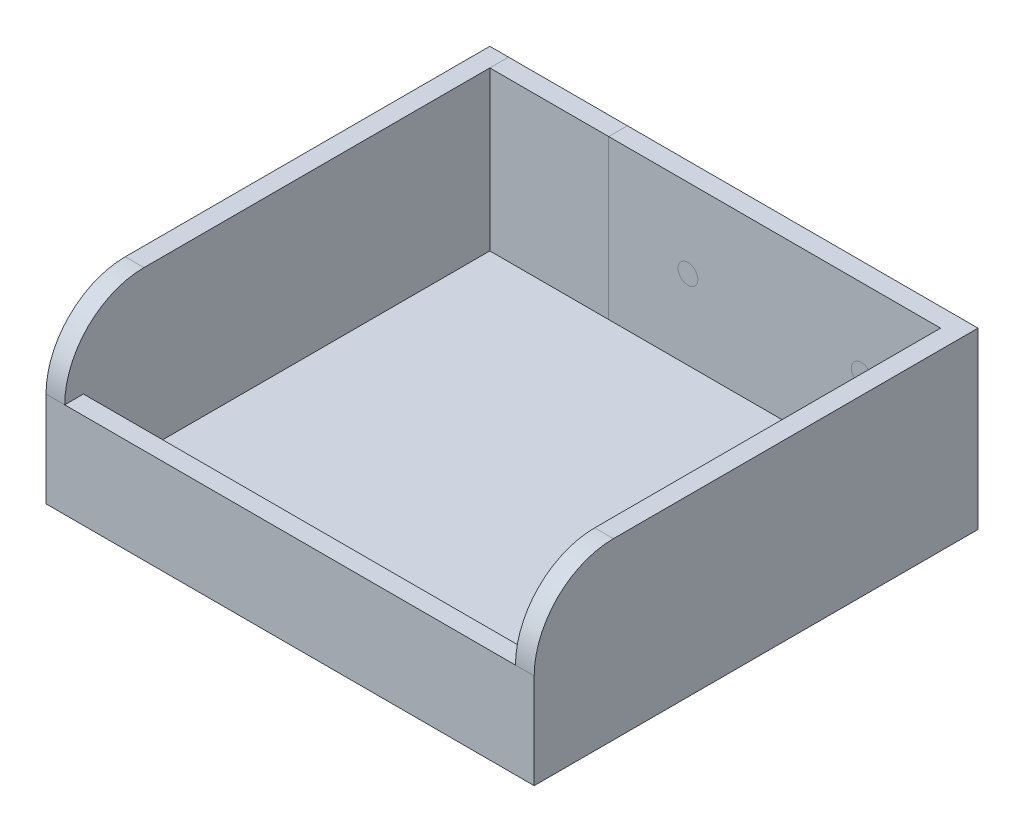
ISO-10303-21;
HEADER;
FILE_DESCRIPTION(('STEP AP214'),'2;1');
FILE_NAME('part.step','',(''),(''),'','','');
FILE_SCHEMA(('AUTOMOTIVE_DESIGN { 1 0 10303 214 1 1 1 1 }'));
ENDSEC;
DATA;
#1=APPLICATION_CONTEXT('core data for automotive mechanical design processes');
#2=APPLICATION_PROTOCOL_DEFINITION('international standard','automotive_design',2000,#1);
#3=PRODUCT_CONTEXT('',#1,'mechanical');
#4=PRODUCT('Part','Part','',(#3));
#5=PRODUCT_RELATED_PRODUCT_CATEGORY('part','',(#4));
#6=PRODUCT_DEFINITION_FORMATION('','',#4);
#7=PRODUCT_DEFINITION_CONTEXT('part definition',#1,'design');
#8=PRODUCT_DEFINITION('design','',#6,#7);
#9=PRODUCT_DEFINITION_SHAPE('','',#8);
#10=(LENGTH_UNIT() NAMED_UNIT(*) SI_UNIT(.MILLI.,.METRE.));
#11=(NAMED_UNIT(*) PLANE_ANGLE_UNIT() SI_UNIT($,.RADIAN.));
#12=(NAMED_UNIT(*) SI_UNIT($,.STERADIAN.) SOLID_ANGLE_UNIT());
#13=UNCERTAINTY_MEASURE_WITH_UNIT(LENGTH_MEASURE(1.E-05),#10,'distance_accuracy_value','');
#14=(GEOMETRIC_REPRESENTATION_CONTEXT(3) GLOBAL_UNCERTAINTY_ASSIGNED_CONTEXT((#13)) GLOBAL_UNIT_ASSIGNED_CONTEXT((#10,
#11,#12)) REPRESENTATION_CONTEXT('',''));
#15=CARTESIAN_POINT('',(0.,0.,0.));
#16=DIRECTION('',(0.,0.,1.));
#17=DIRECTION('',(1.,0.,0.));
#18=AXIS2_PLACEMENT_3D('',#15,#16,#17);
#19=CARTESIAN_POINT('',(-4.366,15.24,-35.56));
#20=DIRECTION('',(0.,0.,1.));
#21=DIRECTION('',(1.,0.,0.));
#22=AXIS2_PLACEMENT_3D('',#19,#20,#21);
#23=CYLINDRICAL_SURFACE('',#22,1.5875);
#24=CARTESIAN_POINT('',(-4.366,15.24,-35.56));
#25=DIRECTION('',(0.,0.,1.));
#26=DIRECTION('',(1.,0.,0.));
#27=AXIS2_PLACEMENT_3D('',#24,#25,#26);
#28=CIRCLE('',#27,1.5875);
#29=CARTESIAN_POINT('',(-2.77850000000001,15.24,-35.56));
#30=VERTEX_POINT('',#29);
#31=EDGE_CURVE('E11',#30,#30,#28,.T.);
#32=ORIENTED_EDGE('',*,*,#31,.T.);
#33=EDGE_LOOP('',(#32));
#34=FACE_BOUND('',#33,.T.);
#35=CARTESIAN_POINT('',(-4.366,15.24,-32.56));
#36=DIRECTION('',(0.,0.,1.));
#37=DIRECTION('',(1.,0.,0.));
#38=AXIS2_PLACEMENT_3D('',#35,#36,#37);
#39=CIRCLE('',#38,1.5875);
#40=CARTESIAN_POINT('',(-2.77850000000001,15.24,-32.56));
#41=VERTEX_POINT('',#40);
#42=EDGE_CURVE('E59',#41,#41,#39,.T.);
#43=ORIENTED_EDGE('',*,*,#42,.F.);
#44=EDGE_LOOP('',(#43));
#45=FACE_BOUND('',#44,.T.);
#46=ADVANCED_FACE('F56',(#34,#45),#23,.T.);
#47=CARTESIAN_POINT('',(-4.366,15.24,-35.56));
#48=DIRECTION('',(0.,0.,1.));
#49=DIRECTION('',(1.,0.,0.));
#50=AXIS2_PLACEMENT_3D('',#47,#48,#49);
#51=PLANE('',#50);
#52=ORIENTED_EDGE('',*,*,#31,.F.);
#53=EDGE_LOOP('',(#52));
#54=FACE_BOUND('',#53,.T.);
#55=ADVANCED_FACE('F71',(#54),#51,.F.);
#56=CARTESIAN_POINT('',(-4.366,15.24,-32.56));
#57=DIRECTION('',(0.,0.,1.));
#58=DIRECTION('',(1.,0.,0.));
#59=AXIS2_PLACEMENT_3D('',#56,#57,#58);
#60=PLANE('',#59);
#61=ORIENTED_EDGE('',*,*,#42,.T.);
#62=EDGE_LOOP('',(#61));
#63=FACE_BOUND('',#62,.T.);
#64=ADVANCED_FACE('F68',(#63),#60,.T.);
#65=CLOSED_SHELL('',(#46,#55,#64));
#66=MANIFOLD_SOLID_BREP('B2',#65);
#67=CARTESIAN_POINT('',(23.416,15.24,-35.56));
#68=DIRECTION('',(0.,0.,1.));
#69=DIRECTION('',(1.,0.,0.));
#70=AXIS2_PLACEMENT_3D('',#67,#68,#69);
#71=CYLINDRICAL_SURFACE('',#70,1.5875);
#72=CARTESIAN_POINT('',(23.416,15.24,-35.56));
#73=DIRECTION('',(0.,0.,1.));
#74=DIRECTION('',(1.,0.,0.));
#75=AXIS2_PLACEMENT_3D('',#72,#73,#74);
#76=CIRCLE('',#75,1.5875);
#77=CARTESIAN_POINT('',(25.0035,15.24,-35.56));
#78=VERTEX_POINT('',#77);
#79=EDGE_CURVE('E55',#78,#78,#76,.T.);
#80=ORIENTED_EDGE('',*,*,#79,.T.);
#81=EDGE_LOOP('',(#80));
#82=FACE_BOUND('',#81,.T.);
#83=CARTESIAN_POINT('',(23.416,15.24,-32.56));
#84=DIRECTION('',(0.,0.,1.));
#85=DIRECTION('',(1.,0.,0.));
#86=AXIS2_PLACEMENT_3D('',#83,#84,#85);
#87=CIRCLE('',#86,1.5875);
#88=CARTESIAN_POINT('',(25.0035,15.24,-32.56));
#89=VERTEX_POINT('',#88);
#90=EDGE_CURVE('E122',#89,#89,#87,.T.);
#91=ORIENTED_EDGE('',*,*,#90,.F.);
#92=EDGE_LOOP('',(#91));
#93=FACE_BOUND('',#92,.T.);
#94=ADVANCED_FACE('F119',(#82,#93),#71,.T.);
#95=CARTESIAN_POINT('',(23.416,15.24,-35.56));
#96=DIRECTION('',(0.,0.,1.));
#97=DIRECTION('',(1.,0.,0.));
#98=AXIS2_PLACEMENT_3D('',#95,#96,#97);
#99=PLANE('',#98);
#100=ORIENTED_EDGE('',*,*,#79,.F.);
#101=EDGE_LOOP('',(#100));
#102=FACE_BOUND('',#101,.T.);
#103=ADVANCED_FACE('F134',(#102),#99,.F.);
#104=CARTESIAN_POINT('',(23.416,15.24,-32.56));
#105=DIRECTION('',(0.,0.,1.));
#106=DIRECTION('',(1.,0.,0.));
#107=AXIS2_PLACEMENT_3D('',#104,#105,#106);
#108=PLANE('',#107);
#109=ORIENTED_EDGE('',*,*,#90,.T.);
#110=EDGE_LOOP('',(#109));
#111=FACE_BOUND('',#110,.T.);
#112=ADVANCED_FACE('F131',(#111),#108,.T.);
#113=CLOSED_SHELL('',(#94,#103,#112));
#114=MANIFOLD_SOLID_BREP('B6',#113);
#115=CARTESIAN_POINT('',(0.,27.94,-32.56));
#116=DIRECTION('',(0.,0.,-1.));
#117=DIRECTION('',(-1.,0.,0.));
#118=AXIS2_PLACEMENT_3D('',#115,#116,#117);
#119=PLANE('',#118);
#120=DIRECTION('',(1.,0.,0.));
#121=VECTOR('',#120,1.);
#122=CARTESIAN_POINT('',(0.,0.,-32.56));
#123=LINE('',#122,#121);
#124=CARTESIAN_POINT('',(-36.116,0.,-32.56));
#125=VERTEX_POINT('',#124);
#126=CARTESIAN_POINT('',(-17.066,0.,-32.56));
#127=VERTEX_POINT('',#126);
#128=EDGE_CURVE('E244',#125,#127,#123,.T.);
#129=ORIENTED_EDGE('',*,*,#128,.T.);
#130=DIRECTION('',(0.,-1.,0.));
#131=VECTOR('',#130,1.);
#132=CARTESIAN_POINT('',(-17.066,27.94,-32.56));
#133=LINE('',#132,#131);
#134=CARTESIAN_POINT('',(-17.066,27.94,-32.56));
#135=VERTEX_POINT('',#134);
#136=EDGE_CURVE('E117',#135,#127,#133,.T.);
#137=ORIENTED_EDGE('',*,*,#136,.F.);
#138=DIRECTION('',(1.,0.,0.));
#139=VECTOR('',#138,1.);
#140=CARTESIAN_POINT('',(0.,27.94,-32.56));
#141=LINE('',#140,#139);
#142=CARTESIAN_POINT('',(-36.116,27.94,-32.56));
#143=VERTEX_POINT('',#142);
#144=EDGE_CURVE('E230',#143,#135,#141,.T.);
#145=ORIENTED_EDGE('',*,*,#144,.F.);
#146=DIRECTION('',(0.,-1.,0.));
#147=VECTOR('',#146,1.);
#148=CARTESIAN_POINT('',(-36.116,27.94,-32.56));
#149=LINE('',#148,#147);
#150=EDGE_CURVE('E197',#143,#125,#149,.T.);
#151=ORIENTED_EDGE('',*,*,#150,.T.);
#152=EDGE_LOOP('',(#129,#137,#145,#151));
#153=FACE_BOUND('',#152,.T.);
#154=ADVANCED_FACE('F181',(#153),#119,.F.);
#155=CARTESIAN_POINT('',(-17.066,27.94,0.));
#156=DIRECTION('',(-1.,0.,0.));
#157=DIRECTION('',(0.,0.,1.));
#158=AXIS2_PLACEMENT_3D('',#155,#156,#157);
#159=PLANE('',#158);
#160=DIRECTION('',(0.,0.,-1.));
#161=VECTOR('',#160,1.);
#162=CARTESIAN_POINT('',(-17.066,0.,0.));
#163=LINE('',#162,#161);
#164=CARTESIAN_POINT('',(-17.066,0.,-35.56));
#165=VERTEX_POINT('',#164);
#166=EDGE_CURVE('E235',#127,#165,#163,.T.);
#167=ORIENTED_EDGE('',*,*,#166,.T.);
#168=DIRECTION('',(0.,-1.,0.));
#169=VECTOR('',#168,1.);
#170=CARTESIAN_POINT('',(-17.066,27.94,-35.56));
#171=LINE('',#170,#169);
#172=CARTESIAN_POINT('',(-17.066,27.94,-35.56));
#173=VERTEX_POINT('',#172);
#174=EDGE_CURVE('E189',#173,#165,#171,.T.);
#175=ORIENTED_EDGE('',*,*,#174,.F.);
#176=DIRECTION('',(0.,0.,-1.));
#177=VECTOR('',#176,1.);
#178=CARTESIAN_POINT('',(-17.066,27.94,0.));
#179=LINE('',#178,#177);
#180=EDGE_CURVE('E222',#135,#173,#179,.T.);
#181=ORIENTED_EDGE('',*,*,#180,.F.);
#182=ORIENTED_EDGE('',*,*,#136,.T.);
#183=EDGE_LOOP('',(#167,#175,#181,#182));
#184=FACE_BOUND('',#183,.T.);
#185=ADVANCED_FACE('F234',(#184),#159,.F.);
#186=CARTESIAN_POINT('',(0.,27.94,-35.56));
#187=DIRECTION('',(0.,0.,-1.));
#188=DIRECTION('',(-1.,0.,0.));
#189=AXIS2_PLACEMENT_3D('',#186,#187,#188);
#190=PLANE('',#189);
#191=DIRECTION('',(1.,0.,0.));
#192=VECTOR('',#191,1.);
#193=CARTESIAN_POINT('',(0.,0.,-35.56));
#194=LINE('',#193,#192);
#195=CARTESIAN_POINT('',(-36.116,0.,-35.56));
#196=VERTEX_POINT('',#195);
#197=EDGE_CURVE('E247',#196,#165,#194,.T.);
#198=ORIENTED_EDGE('',*,*,#197,.F.);
#199=DIRECTION('',(0.,-1.,0.));
#200=VECTOR('',#199,1.);
#201=CARTESIAN_POINT('',(-36.116,27.94,-35.56));
#202=LINE('',#201,#200);
#203=CARTESIAN_POINT('',(-36.116,27.94,-35.56));
#204=VERTEX_POINT('',#203);
#205=EDGE_CURVE('E211',#204,#196,#202,.T.);
#206=ORIENTED_EDGE('',*,*,#205,.F.);
#207=DIRECTION('',(1.,0.,0.));
#208=VECTOR('',#207,1.);
#209=CARTESIAN_POINT('',(0.,27.94,-35.56));
#210=LINE('',#209,#208);
#211=EDGE_CURVE('E229',#204,#173,#210,.T.);
#212=ORIENTED_EDGE('',*,*,#211,.T.);
#213=ORIENTED_EDGE('',*,*,#174,.T.);
#214=EDGE_LOOP('',(#198,#206,#212,#213));
#215=FACE_BOUND('',#214,.T.);
#216=ADVANCED_FACE('F238',(#215),#190,.T.);
#217=CARTESIAN_POINT('',(-36.116,27.94,0.));
#218=DIRECTION('',(-1.,0.,0.));
#219=DIRECTION('',(0.,0.,1.));
#220=AXIS2_PLACEMENT_3D('',#217,#218,#219);
#221=PLANE('',#220);
#222=DIRECTION('',(0.,0.,-1.));
#223=VECTOR('',#222,1.);
#224=CARTESIAN_POINT('',(-36.116,0.,0.));
#225=LINE('',#224,#223);
#226=EDGE_CURVE('E249',#125,#196,#225,.T.);
#227=ORIENTED_EDGE('',*,*,#226,.F.);
#228=ORIENTED_EDGE('',*,*,#150,.F.);
#229=DIRECTION('',(0.,0.,-1.));
#230=VECTOR('',#229,1.);
#231=CARTESIAN_POINT('',(-36.116,27.94,0.));
#232=LINE('',#231,#230);
#233=EDGE_CURVE('E239',#143,#204,#232,.T.);
#234=ORIENTED_EDGE('',*,*,#233,.T.);
#235=ORIENTED_EDGE('',*,*,#205,.T.);
#236=EDGE_LOOP('',(#227,#228,#234,#235));
#237=FACE_BOUND('',#236,.T.);
#238=ADVANCED_FACE('F255',(#237),#221,.T.);
#239=CARTESIAN_POINT('',(0.,27.94,0.));
#240=DIRECTION('',(0.,1.,0.));
#241=DIRECTION('',(0.,0.,1.));
#242=AXIS2_PLACEMENT_3D('',#239,#240,#241);
#243=PLANE('',#242);
#244=ORIENTED_EDGE('',*,*,#144,.T.);
#245=ORIENTED_EDGE('',*,*,#180,.T.);
#246=ORIENTED_EDGE('',*,*,#211,.F.);
#247=ORIENTED_EDGE('',*,*,#233,.F.);
#248=EDGE_LOOP('',(#244,#245,#246,#247));
#249=FACE_BOUND('',#248,.T.);
#250=ADVANCED_FACE('F226',(#249),#243,.T.);
#251=CARTESIAN_POINT('',(0.,0.,0.));
#252=DIRECTION('',(0.,1.,0.));
#253=DIRECTION('',(0.,0.,1.));
#254=AXIS2_PLACEMENT_3D('',#251,#252,#253);
#255=PLANE('',#254);
#256=ORIENTED_EDGE('',*,*,#128,.F.);
#257=ORIENTED_EDGE('',*,*,#226,.T.);
#258=ORIENTED_EDGE('',*,*,#197,.T.);
#259=ORIENTED_EDGE('',*,*,#166,.F.);
#260=EDGE_LOOP('',(#256,#257,#258,#259));
#261=FACE_BOUND('',#260,.T.);
#262=ADVANCED_FACE('F254',(#261),#255,.F.);
#263=CLOSED_SHELL('',(#154,#185,#216,#238,#250,#262));
#264=MANIFOLD_SOLID_BREP('B50',#263);
#265=CARTESIAN_POINT('',(0.,27.94,0.));
#266=DIRECTION('',(0.,1.,0.));
#267=DIRECTION('',(0.,0.,1.));
#268=AXIS2_PLACEMENT_3D('',#265,#266,#267);
#269=PLANE('',#268);
#270=DIRECTION('',(0.,0.,1.));
#271=VECTOR('',#270,1.);
#272=CARTESIAN_POINT('',(-39.116,27.94,0.));
#273=LINE('',#272,#271);
#274=CARTESIAN_POINT('',(-39.116,27.94,-35.56));
#275=VERTEX_POINT('',#274);
#276=CARTESIAN_POINT('',(-39.116,27.94,22.86));
#277=VERTEX_POINT('',#276);
#278=EDGE_CURVE('E533',#275,#277,#273,.T.);
#279=ORIENTED_EDGE('',*,*,#278,.T.);
#280=DIRECTION('',(1.,0.,0.));
#281=VECTOR('',#280,1.);
#282=CARTESIAN_POINT('',(-36.116,27.94,22.86));
#283=LINE('',#282,#281);
#284=CARTESIAN_POINT('',(-36.116,27.94,22.86));
#285=VERTEX_POINT('',#284);
#286=EDGE_CURVE('E467',#277,#285,#283,.T.);
#287=ORIENTED_EDGE('',*,*,#286,.T.);
#288=DIRECTION('',(0.,0.,1.));
#289=VECTOR('',#288,1.);
#290=CARTESIAN_POINT('',(-36.116,27.94,0.));
#291=LINE('',#290,#289);
#292=CARTESIAN_POINT('',(-36.116,27.94,-35.56));
#293=VERTEX_POINT('',#292);
#294=EDGE_CURVE('E539',#293,#285,#291,.T.);
#295=ORIENTED_EDGE('',*,*,#294,.F.);
#296=DIRECTION('',(1.,0.,0.));
#297=VECTOR('',#296,1.);
#298=CARTESIAN_POINT('',(0.,27.94,-35.56));
#299=LINE('',#298,#297);
#300=EDGE_CURVE('E536',#275,#293,#299,.T.);
#301=ORIENTED_EDGE('',*,*,#300,.F.);
#302=EDGE_LOOP('',(#279,#287,#295,#301));
#303=FACE_BOUND('',#302,.T.);
#304=ADVANCED_FACE('F329',(#303),#269,.T.);
#305=CARTESIAN_POINT('',(-36.116,2.54,-32.56));
#306=DIRECTION('',(0.,0.,-1.));
#307=DIRECTION('',(-1.,0.,0.));
#308=AXIS2_PLACEMENT_3D('',#305,#306,#307);
#309=PLANE('',#308);
#310=DIRECTION('',(0.,-1.,0.));
#311=VECTOR('',#310,1.);
#312=CARTESIAN_POINT('',(-17.066,27.94,-32.56));
#313=LINE('',#312,#311);
#314=CARTESIAN_POINT('',(-17.066,2.54,-32.56));
#315=VERTEX_POINT('',#314);
#316=CARTESIAN_POINT('',(-17.066,0.,-32.56));
#317=VERTEX_POINT('',#316);
#318=EDGE_CURVE('E493',#315,#317,#313,.T.);
#319=ORIENTED_EDGE('',*,*,#318,.T.);
#320=DIRECTION('',(1.,0.,0.));
#321=VECTOR('',#320,1.);
#322=CARTESIAN_POINT('',(-36.116,0.,-32.56));
#323=LINE('',#322,#321);
#324=CARTESIAN_POINT('',(-36.116,0.,-32.56));
#325=VERTEX_POINT('',#324);
#326=EDGE_CURVE('E474',#325,#317,#323,.T.);
#327=ORIENTED_EDGE('',*,*,#326,.F.);
#328=DIRECTION('',(0.,-1.,0.));
#329=VECTOR('',#328,1.);
#330=CARTESIAN_POINT('',(-36.116,2.54,-32.56));
#331=LINE('',#330,#329);
#332=CARTESIAN_POINT('',(-36.116,2.54,-32.56));
#333=VERTEX_POINT('',#332);
#334=EDGE_CURVE('E470',#333,#325,#331,.T.);
#335=ORIENTED_EDGE('',*,*,#334,.F.);
#336=DIRECTION('',(1.,0.,0.));
#337=VECTOR('',#336,1.);
#338=CARTESIAN_POINT('',(-36.116,2.54,-32.56));
#339=LINE('',#338,#337);
#340=EDGE_CURVE('E477',#333,#315,#339,.T.);
#341=ORIENTED_EDGE('',*,*,#340,.T.);
#342=EDGE_LOOP('',(#319,#327,#335,#341));
#343=FACE_BOUND('',#342,.T.);
#344=ADVANCED_FACE('F589',(#343),#309,.T.);
#345=CARTESIAN_POINT('',(0.,2.54,0.));
#346=DIRECTION('',(0.,-1.,0.));
#347=DIRECTION('',(0.,0.,-1.));
#348=AXIS2_PLACEMENT_3D('',#345,#346,#347);
#349=PLANE('',#348);
#350=ORIENTED_EDGE('',*,*,#340,.F.);
#351=DIRECTION('',(0.,0.,1.));
#352=VECTOR('',#351,1.);
#353=CARTESIAN_POINT('',(-36.116,2.54,-32.56));
#354=LINE('',#353,#352);
#355=CARTESIAN_POINT('',(-36.116,2.54,32.56));
#356=VERTEX_POINT('',#355);
#357=EDGE_CURVE('E473',#333,#356,#354,.T.);
#358=ORIENTED_EDGE('',*,*,#357,.T.);
#359=DIRECTION('',(1.,0.,0.));
#360=VECTOR('',#359,1.);
#361=CARTESIAN_POINT('',(-36.116,2.54,32.56));
#362=LINE('',#361,#360);
#363=CARTESIAN_POINT('',(36.116,2.54,32.56));
#364=VERTEX_POINT('',#363);
#365=EDGE_CURVE('E481',#356,#364,#362,.T.);
#366=ORIENTED_EDGE('',*,*,#365,.T.);
#367=DIRECTION('',(0.,0.,1.));
#368=VECTOR('',#367,1.);
#369=CARTESIAN_POINT('',(36.116,2.54,-32.56));
#370=LINE('',#369,#368);
#371=CARTESIAN_POINT('',(36.116,2.54,-32.56));
#372=VERTEX_POINT('',#371);
#373=EDGE_CURVE('E484',#372,#364,#370,.T.);
#374=ORIENTED_EDGE('',*,*,#373,.F.);
#375=DIRECTION('',(1.,0.,0.));
#376=VECTOR('',#375,1.);
#377=CARTESIAN_POINT('',(0.,2.54,-32.56));
#378=LINE('',#377,#376);
#379=EDGE_CURVE('E478',#315,#372,#378,.T.);
#380=ORIENTED_EDGE('',*,*,#379,.F.);
#381=EDGE_LOOP('',(#350,#358,#366,#374,#380));
#382=FACE_BOUND('',#381,.T.);
#383=ADVANCED_FACE('F602',(#382),#349,.F.);
#384=CARTESIAN_POINT('',(0.,0.,0.));
#385=DIRECTION('',(0.,-1.,0.));
#386=DIRECTION('',(0.,0.,-1.));
#387=AXIS2_PLACEMENT_3D('',#384,#385,#386);
#388=PLANE('',#387);
#389=ORIENTED_EDGE('',*,*,#326,.T.);
#390=DIRECTION('',(0.,0.,-1.));
#391=VECTOR('',#390,1.);
#392=CARTESIAN_POINT('',(-17.066,0.,0.));
#393=LINE('',#392,#391);
#394=CARTESIAN_POINT('',(-17.066,0.,-35.56));
#395=VERTEX_POINT('',#394);
#396=EDGE_CURVE('E527',#317,#395,#393,.T.);
#397=ORIENTED_EDGE('',*,*,#396,.T.);
#398=DIRECTION('',(1.,0.,0.));
#399=VECTOR('',#398,1.);
#400=CARTESIAN_POINT('',(0.,0.,-35.56));
#401=LINE('',#400,#399);
#402=CARTESIAN_POINT('',(39.116,0.,-35.56));
#403=VERTEX_POINT('',#402);
#404=EDGE_CURVE('E515',#395,#403,#401,.T.);
#405=ORIENTED_EDGE('',*,*,#404,.T.);
#406=DIRECTION('',(0.,0.,1.));
#407=VECTOR('',#406,1.);
#408=CARTESIAN_POINT('',(39.116,0.,0.));
#409=LINE('',#408,#407);
#410=CARTESIAN_POINT('',(39.116,0.,35.56));
#411=VERTEX_POINT('',#410);
#412=EDGE_CURVE('E512',#403,#411,#409,.T.);
#413=ORIENTED_EDGE('',*,*,#412,.T.);
#414=DIRECTION('',(1.,0.,0.));
#415=VECTOR('',#414,1.);
#416=CARTESIAN_POINT('',(0.,0.,35.56));
#417=LINE('',#416,#415);
#418=CARTESIAN_POINT('',(-39.116,0.,35.56));
#419=VERTEX_POINT('',#418);
#420=EDGE_CURVE('E516',#419,#411,#417,.T.);
#421=ORIENTED_EDGE('',*,*,#420,.F.);
#422=DIRECTION('',(0.,0.,1.));
#423=VECTOR('',#422,1.);
#424=CARTESIAN_POINT('',(-39.116,0.,0.));
#425=LINE('',#424,#423);
#426=CARTESIAN_POINT('',(-39.116,0.,-35.56));
#427=VERTEX_POINT('',#426);
#428=EDGE_CURVE('E518',#427,#419,#425,.T.);
#429=ORIENTED_EDGE('',*,*,#428,.F.);
#430=CARTESIAN_POINT('',(-36.116,0.,-35.56));
#431=VERTEX_POINT('',#430);
#432=EDGE_CURVE('E521',#427,#431,#401,.T.);
#433=ORIENTED_EDGE('',*,*,#432,.T.);
#434=DIRECTION('',(0.,0.,1.));
#435=VECTOR('',#434,1.);
#436=CARTESIAN_POINT('',(-36.116,0.,0.));
#437=LINE('',#436,#435);
#438=EDGE_CURVE('E524',#431,#325,#437,.T.);
#439=ORIENTED_EDGE('',*,*,#438,.T.);
#440=EDGE_LOOP('',(#389,#397,#405,#413,#421,#429,#433,#439));
#441=FACE_BOUND('',#440,.T.);
#442=ADVANCED_FACE('F576',(#441),#388,.T.);
#443=CARTESIAN_POINT('',(0.,27.94,-32.56));
#444=DIRECTION('',(0.,0.,-1.));
#445=DIRECTION('',(-1.,0.,0.));
#446=AXIS2_PLACEMENT_3D('',#443,#444,#445);
#447=PLANE('',#446);
#448=CARTESIAN_POINT('',(23.416,15.24,-32.56));
#449=DIRECTION('',(0.,0.,1.));
#450=DIRECTION('',(1.,0.,0.));
#451=AXIS2_PLACEMENT_3D('',#448,#449,#450);
#452=CIRCLE('',#451,1.5875);
#453=CARTESIAN_POINT('',(25.0035,15.24,-32.56));
#454=VERTEX_POINT('',#453);
#455=EDGE_CURVE('E557',#454,#454,#452,.T.);
#456=ORIENTED_EDGE('',*,*,#455,.F.);
#457=EDGE_LOOP('',(#456));
#458=FACE_BOUND('',#457,.T.);
#459=CARTESIAN_POINT('',(-4.366,15.24,-32.56));
#460=DIRECTION('',(0.,0.,1.));
#461=DIRECTION('',(1.,0.,0.));
#462=AXIS2_PLACEMENT_3D('',#459,#460,#461);
#463=CIRCLE('',#462,1.5875);
#464=CARTESIAN_POINT('',(-2.77850000000001,15.24,-32.56));
#465=VERTEX_POINT('',#464);
#466=EDGE_CURVE('E554',#465,#465,#463,.T.);
#467=ORIENTED_EDGE('',*,*,#466,.F.);
#468=EDGE_LOOP('',(#467));
#469=FACE_BOUND('',#468,.T.);
#470=CARTESIAN_POINT('',(-17.066,27.94,-32.56));
#471=VERTEX_POINT('',#470);
#472=EDGE_CURVE('E490',#471,#315,#313,.T.);
#473=ORIENTED_EDGE('',*,*,#472,.T.);
#474=ORIENTED_EDGE('',*,*,#379,.T.);
#475=DIRECTION('',(0.,-1.,0.));
#476=VECTOR('',#475,1.);
#477=CARTESIAN_POINT('',(36.116,27.94,-32.56));
#478=LINE('',#477,#476);
#479=CARTESIAN_POINT('',(36.116,27.94,-32.56));
#480=VERTEX_POINT('',#479);
#481=EDGE_CURVE('E494',#480,#372,#478,.T.);
#482=ORIENTED_EDGE('',*,*,#481,.F.);
#483=DIRECTION('',(1.,0.,0.));
#484=VECTOR('',#483,1.);
#485=CARTESIAN_POINT('',(0.,27.94,-32.56));
#486=LINE('',#485,#484);
#487=EDGE_CURVE('E544',#471,#480,#486,.T.);
#488=ORIENTED_EDGE('',*,*,#487,.F.);
#489=EDGE_LOOP('',(#473,#474,#482,#488));
#490=FACE_BOUND('',#489,.T.);
#491=ADVANCED_FACE('F573',(#458,#469,#490),#447,.F.);
#492=CARTESIAN_POINT('',(36.116,27.94,0.));
#493=DIRECTION('',(1.,0.,0.));
#494=DIRECTION('',(0.,0.,-1.));
#495=AXIS2_PLACEMENT_3D('',#492,#493,#494);
#496=PLANE('',#495);
#497=DIRECTION('',(0.,0.,1.));
#498=VECTOR('',#497,1.);
#499=CARTESIAN_POINT('',(36.116,15.24,7.61999999999999));
#500=LINE('',#499,#498);
#501=CARTESIAN_POINT('',(36.116,15.24,32.56));
#502=VERTEX_POINT('',#501);
#503=CARTESIAN_POINT('',(36.116,15.24,35.56));
#504=VERTEX_POINT('',#503);
#505=EDGE_CURVE('E444',#502,#504,#500,.T.);
#506=ORIENTED_EDGE('',*,*,#505,.T.);
#507=CARTESIAN_POINT('',(36.116,15.24,22.86));
#508=DIRECTION('',(1.,0.,0.));
#509=DIRECTION('',(0.,0.,-1.));
#510=AXIS2_PLACEMENT_3D('',#507,#508,#509);
#511=CIRCLE('',#510,12.7);
#512=CARTESIAN_POINT('',(36.116,27.94,22.86));
#513=VERTEX_POINT('',#512);
#514=EDGE_CURVE('E179',#504,#513,#511,.F.);
#515=ORIENTED_EDGE('',*,*,#514,.T.);
#516=DIRECTION('',(0.,0.,1.));
#517=VECTOR('',#516,1.);
#518=CARTESIAN_POINT('',(36.116,27.94,0.));
#519=LINE('',#518,#517);
#520=EDGE_CURVE('E542',#480,#513,#519,.T.);
#521=ORIENTED_EDGE('',*,*,#520,.F.);
#522=ORIENTED_EDGE('',*,*,#481,.T.);
#523=ORIENTED_EDGE('',*,*,#373,.T.);
#524=DIRECTION('',(0.,-1.,0.));
#525=VECTOR('',#524,1.);
#526=CARTESIAN_POINT('',(36.116,27.94,32.56));
#527=LINE('',#526,#525);
#528=EDGE_CURVE('E447',#502,#364,#527,.T.);
#529=ORIENTED_EDGE('',*,*,#528,.F.);
#530=EDGE_LOOP('',(#506,#515,#521,#522,#523,#529));
#531=FACE_BOUND('',#530,.T.);
#532=ADVANCED_FACE('F445',(#531),#496,.F.);
#533=CARTESIAN_POINT('',(0.,27.94,32.56));
#534=DIRECTION('',(0.,0.,-1.));
#535=DIRECTION('',(-1.,0.,0.));
#536=AXIS2_PLACEMENT_3D('',#533,#534,#535);
#537=PLANE('',#536);
#538=DIRECTION('',(-1.,0.,0.));
#539=VECTOR('',#538,1.);
#540=CARTESIAN_POINT('',(0.,15.24,32.56));
#541=LINE('',#540,#539);
#542=CARTESIAN_POINT('',(-36.116,15.24,32.56));
#543=VERTEX_POINT('',#542);
#544=EDGE_CURVE('E530',#502,#543,#541,.T.);
#545=ORIENTED_EDGE('',*,*,#544,.F.);
#546=ORIENTED_EDGE('',*,*,#528,.T.);
#547=ORIENTED_EDGE('',*,*,#365,.F.);
#548=DIRECTION('',(0.,-1.,0.));
#549=VECTOR('',#548,1.);
#550=CARTESIAN_POINT('',(-36.116,27.94,32.56));
#551=LINE('',#550,#549);
#552=EDGE_CURVE('E498',#543,#356,#551,.T.);
#553=ORIENTED_EDGE('',*,*,#552,.F.);
#554=EDGE_LOOP('',(#545,#546,#547,#553));
#555=FACE_BOUND('',#554,.T.);
#556=ADVANCED_FACE('F658',(#555),#537,.T.);
#557=CARTESIAN_POINT('',(-17.066,27.94,0.));
#558=DIRECTION('',(-1.,0.,0.));
#559=DIRECTION('',(0.,0.,1.));
#560=AXIS2_PLACEMENT_3D('',#557,#558,#559);
#561=PLANE('',#560);
#562=ORIENTED_EDGE('',*,*,#396,.F.);
#563=ORIENTED_EDGE('',*,*,#318,.F.);
#564=ORIENTED_EDGE('',*,*,#472,.F.);
#565=DIRECTION('',(0.,0.,-1.));
#566=VECTOR('',#565,1.);
#567=CARTESIAN_POINT('',(-17.066,27.94,0.));
#568=LINE('',#567,#566);
#569=CARTESIAN_POINT('',(-17.066,27.94,-35.56));
#570=VERTEX_POINT('',#569);
#571=EDGE_CURVE('E546',#471,#570,#568,.T.);
#572=ORIENTED_EDGE('',*,*,#571,.T.);
#573=DIRECTION('',(0.,-1.,0.));
#574=VECTOR('',#573,1.);
#575=CARTESIAN_POINT('',(-17.066,27.94,-35.56));
#576=LINE('',#575,#574);
#577=EDGE_CURVE('E509',#570,#395,#576,.T.);
#578=ORIENTED_EDGE('',*,*,#577,.T.);
#579=EDGE_LOOP('',(#562,#563,#564,#572,#578));
#580=FACE_BOUND('',#579,.T.);
#581=ADVANCED_FACE('F586',(#580),#561,.T.);
#582=CARTESIAN_POINT('',(-36.116,27.94,0.));
#583=DIRECTION('',(1.,0.,0.));
#584=DIRECTION('',(0.,0.,-1.));
#585=AXIS2_PLACEMENT_3D('',#582,#583,#584);
#586=PLANE('',#585);
#587=ORIENTED_EDGE('',*,*,#294,.T.);
#588=CARTESIAN_POINT('',(-36.116,15.24,22.86));
#589=DIRECTION('',(1.,0.,0.));
#590=DIRECTION('',(0.,0.,-1.));
#591=AXIS2_PLACEMENT_3D('',#588,#589,#590);
#592=CIRCLE('',#591,12.7);
#593=CARTESIAN_POINT('',(-36.116,15.24,35.56));
#594=VERTEX_POINT('',#593);
#595=EDGE_CURVE('E441',#285,#594,#592,.T.);
#596=ORIENTED_EDGE('',*,*,#595,.T.);
#597=DIRECTION('',(0.,0.,1.));
#598=VECTOR('',#597,1.);
#599=CARTESIAN_POINT('',(-36.116,15.24,7.61999999999999));
#600=LINE('',#599,#598);
#601=EDGE_CURVE('E450',#543,#594,#600,.T.);
#602=ORIENTED_EDGE('',*,*,#601,.F.);
#603=ORIENTED_EDGE('',*,*,#552,.T.);
#604=ORIENTED_EDGE('',*,*,#357,.F.);
#605=ORIENTED_EDGE('',*,*,#334,.T.);
#606=ORIENTED_EDGE('',*,*,#438,.F.);
#607=DIRECTION('',(0.,-1.,0.));
#608=VECTOR('',#607,1.);
#609=CARTESIAN_POINT('',(-36.116,27.94,-35.56));
#610=LINE('',#609,#608);
#611=EDGE_CURVE('E500',#293,#431,#610,.T.);
#612=ORIENTED_EDGE('',*,*,#611,.F.);
#613=EDGE_LOOP('',(#587,#596,#602,#603,#604,#605,#606,#612));
#614=FACE_BOUND('',#613,.T.);
#615=ADVANCED_FACE('F598',(#614),#586,.T.);
#616=CARTESIAN_POINT('',(0.,27.94,-35.56));
#617=DIRECTION('',(0.,0.,-1.));
#618=DIRECTION('',(-1.,0.,0.));
#619=AXIS2_PLACEMENT_3D('',#616,#617,#618);
#620=PLANE('',#619);
#621=ORIENTED_EDGE('',*,*,#432,.F.);
#622=DIRECTION('',(0.,-1.,0.));
#623=VECTOR('',#622,1.);
#624=CARTESIAN_POINT('',(-39.116,27.94,-35.56));
#625=LINE('',#624,#623);
#626=EDGE_CURVE('E502',#275,#427,#625,.T.);
#627=ORIENTED_EDGE('',*,*,#626,.F.);
#628=ORIENTED_EDGE('',*,*,#300,.T.);
#629=ORIENTED_EDGE('',*,*,#611,.T.);
#630=EDGE_LOOP('',(#621,#627,#628,#629));
#631=FACE_BOUND('',#630,.T.);
#632=ADVANCED_FACE('F617',(#631),#620,.T.);
#633=CARTESIAN_POINT('',(-39.116,27.94,0.));
#634=DIRECTION('',(1.,0.,0.));
#635=DIRECTION('',(0.,0.,-1.));
#636=AXIS2_PLACEMENT_3D('',#633,#634,#635);
#637=PLANE('',#636);
#638=DIRECTION('',(0.,-1.,0.));
#639=VECTOR('',#638,1.);
#640=CARTESIAN_POINT('',(-39.116,27.94,35.56));
#641=LINE('',#640,#639);
#642=CARTESIAN_POINT('',(-39.116,15.24,35.56));
#643=VERTEX_POINT('',#642);
#644=EDGE_CURVE('E504',#643,#419,#641,.T.);
#645=ORIENTED_EDGE('',*,*,#644,.F.);
#646=CARTESIAN_POINT('',(-39.116,15.24,22.86));
#647=DIRECTION('',(1.,0.,0.));
#648=DIRECTION('',(0.,0.,-1.));
#649=AXIS2_PLACEMENT_3D('',#646,#647,#648);
#650=CIRCLE('',#649,12.7);
#651=EDGE_CURVE('E461',#643,#277,#650,.F.);
#652=ORIENTED_EDGE('',*,*,#651,.T.);
#653=ORIENTED_EDGE('',*,*,#278,.F.);
#654=ORIENTED_EDGE('',*,*,#626,.T.);
#655=ORIENTED_EDGE('',*,*,#428,.T.);
#656=EDGE_LOOP('',(#645,#652,#653,#654,#655));
#657=FACE_BOUND('',#656,.T.);
#658=ADVANCED_FACE('F614',(#657),#637,.F.);
#659=CARTESIAN_POINT('',(0.,27.94,35.56));
#660=DIRECTION('',(0.,0.,-1.));
#661=DIRECTION('',(-1.,0.,0.));
#662=AXIS2_PLACEMENT_3D('',#659,#660,#661);
#663=PLANE('',#662);
#664=DIRECTION('',(1.,0.,0.));
#665=VECTOR('',#664,1.);
#666=CARTESIAN_POINT('',(0.,15.24,35.56));
#667=LINE('',#666,#665);
#668=EDGE_CURVE('E436',#594,#504,#667,.T.);
#669=ORIENTED_EDGE('',*,*,#668,.F.);
#670=DIRECTION('',(1.,0.,0.));
#671=VECTOR('',#670,1.);
#672=CARTESIAN_POINT('',(-39.116,15.24,35.56));
#673=LINE('',#672,#671);
#674=EDGE_CURVE('E440',#594,#643,#673,.F.);
#675=ORIENTED_EDGE('',*,*,#674,.T.);
#676=ORIENTED_EDGE('',*,*,#644,.T.);
#677=ORIENTED_EDGE('',*,*,#420,.T.);
#678=DIRECTION('',(0.,-1.,0.));
#679=VECTOR('',#678,1.);
#680=CARTESIAN_POINT('',(39.116,27.94,35.56));
#681=LINE('',#680,#679);
#682=CARTESIAN_POINT('',(39.116,15.24,35.56));
#683=VERTEX_POINT('',#682);
#684=EDGE_CURVE('E439',#683,#411,#681,.T.);
#685=ORIENTED_EDGE('',*,*,#684,.F.);
#686=DIRECTION('',(1.,0.,0.));
#687=VECTOR('',#686,1.);
#688=CARTESIAN_POINT('',(36.116,15.24,35.56));
#689=LINE('',#688,#687);
#690=EDGE_CURVE('E433',#683,#504,#689,.F.);
#691=ORIENTED_EDGE('',*,*,#690,.T.);
#692=EDGE_LOOP('',(#669,#675,#676,#677,#685,#691));
#693=FACE_BOUND('',#692,.T.);
#694=ADVANCED_FACE('F434',(#693),#663,.F.);
#695=CARTESIAN_POINT('',(39.116,27.94,0.));
#696=DIRECTION('',(1.,0.,0.));
#697=DIRECTION('',(0.,0.,-1.));
#698=AXIS2_PLACEMENT_3D('',#695,#696,#697);
#699=PLANE('',#698);
#700=DIRECTION('',(0.,0.,1.));
#701=VECTOR('',#700,1.);
#702=CARTESIAN_POINT('',(39.116,27.94,0.));
#703=LINE('',#702,#701);
#704=CARTESIAN_POINT('',(39.116,27.94,-35.56));
#705=VERTEX_POINT('',#704);
#706=CARTESIAN_POINT('',(39.116,27.94,22.86));
#707=VERTEX_POINT('',#706);
#708=EDGE_CURVE('E531',#705,#707,#703,.T.);
#709=ORIENTED_EDGE('',*,*,#708,.T.);
#710=CARTESIAN_POINT('',(39.116,15.24,22.86));
#711=DIRECTION('',(1.,0.,0.));
#712=DIRECTION('',(0.,0.,-1.));
#713=AXIS2_PLACEMENT_3D('',#710,#711,#712);
#714=CIRCLE('',#713,12.7);
#715=EDGE_CURVE('E337',#707,#683,#714,.T.);
#716=ORIENTED_EDGE('',*,*,#715,.T.);
#717=ORIENTED_EDGE('',*,*,#684,.T.);
#718=ORIENTED_EDGE('',*,*,#412,.F.);
#719=DIRECTION('',(0.,-1.,0.));
#720=VECTOR('',#719,1.);
#721=CARTESIAN_POINT('',(39.116,27.94,-35.56));
#722=LINE('',#721,#720);
#723=EDGE_CURVE('E507',#705,#403,#722,.T.);
#724=ORIENTED_EDGE('',*,*,#723,.F.);
#725=EDGE_LOOP('',(#709,#716,#717,#718,#724));
#726=FACE_BOUND('',#725,.T.);
#727=ADVANCED_FACE('F610',(#726),#699,.T.);
#728=CARTESIAN_POINT('',(23.416,15.24,-35.56));
#729=DIRECTION('',(0.,0.,1.));
#730=DIRECTION('',(1.,0.,0.));
#731=AXIS2_PLACEMENT_3D('',#728,#729,#730);
#732=CIRCLE('',#731,1.5875);
#733=CARTESIAN_POINT('',(25.0035,15.24,-35.56));
#734=VERTEX_POINT('',#733);
#735=EDGE_CURVE('E455',#734,#734,#732,.T.);
#736=ORIENTED_EDGE('',*,*,#735,.T.);
#737=EDGE_LOOP('',(#736));
#738=FACE_BOUND('',#737,.T.);
#739=CARTESIAN_POINT('',(-4.366,15.24,-35.56));
#740=DIRECTION('',(0.,0.,1.));
#741=DIRECTION('',(1.,0.,0.));
#742=AXIS2_PLACEMENT_3D('',#739,#740,#741);
#743=CIRCLE('',#742,1.5875);
#744=CARTESIAN_POINT('',(-2.77850000000001,15.24,-35.56));
#745=VERTEX_POINT('',#744);
#746=EDGE_CURVE('E551',#745,#745,#743,.T.);
#747=ORIENTED_EDGE('',*,*,#746,.T.);
#748=EDGE_LOOP('',(#747));
#749=FACE_BOUND('',#748,.T.);
#750=ORIENTED_EDGE('',*,*,#404,.F.);
#751=ORIENTED_EDGE('',*,*,#577,.F.);
#752=EDGE_CURVE('E511',#570,#705,#299,.T.);
#753=ORIENTED_EDGE('',*,*,#752,.T.);
#754=ORIENTED_EDGE('',*,*,#723,.T.);
#755=EDGE_LOOP('',(#750,#751,#753,#754));
#756=FACE_BOUND('',#755,.T.);
#757=ADVANCED_FACE('F563',(#738,#749,#756),#620,.T.);
#758=ORIENTED_EDGE('',*,*,#520,.T.);
#759=DIRECTION('',(1.,0.,0.));
#760=VECTOR('',#759,1.);
#761=CARTESIAN_POINT('',(39.116,27.94,22.86));
#762=LINE('',#761,#760);
#763=EDGE_CURVE('E457',#513,#707,#762,.T.);
#764=ORIENTED_EDGE('',*,*,#763,.T.);
#765=ORIENTED_EDGE('',*,*,#708,.F.);
#766=ORIENTED_EDGE('',*,*,#752,.F.);
#767=ORIENTED_EDGE('',*,*,#571,.F.);
#768=ORIENTED_EDGE('',*,*,#487,.T.);
#769=EDGE_LOOP('',(#758,#764,#765,#766,#767,#768));
#770=FACE_BOUND('',#769,.T.);
#771=ADVANCED_FACE('F604',(#770),#269,.T.);
#772=CARTESIAN_POINT('',(0.,15.24,7.61999999999999));
#773=DIRECTION('',(0.,-1.,0.));
#774=DIRECTION('',(0.,0.,-1.));
#775=AXIS2_PLACEMENT_3D('',#772,#773,#774);
#776=PLANE('',#775);
#777=ORIENTED_EDGE('',*,*,#544,.T.);
#778=ORIENTED_EDGE('',*,*,#601,.T.);
#779=ORIENTED_EDGE('',*,*,#668,.T.);
#780=ORIENTED_EDGE('',*,*,#505,.F.);
#781=EDGE_LOOP('',(#777,#778,#779,#780));
#782=FACE_BOUND('',#781,.T.);
#783=ADVANCED_FACE('F453',(#782),#776,.F.);
#784=CARTESIAN_POINT('',(0.,15.24,22.86));
#785=DIRECTION('',(-1.,0.,0.));
#786=DIRECTION('',(0.,0.,1.));
#787=AXIS2_PLACEMENT_3D('',#784,#785,#786);
#788=CYLINDRICAL_SURFACE('',#787,12.7);
#789=ORIENTED_EDGE('',*,*,#651,.F.);
#790=ORIENTED_EDGE('',*,*,#674,.F.);
#791=ORIENTED_EDGE('',*,*,#595,.F.);
#792=ORIENTED_EDGE('',*,*,#286,.F.);
#793=EDGE_LOOP('',(#789,#790,#791,#792));
#794=FACE_BOUND('',#793,.T.);
#795=ADVANCED_FACE('F623',(#794),#788,.T.);
#796=CARTESIAN_POINT('',(0.,15.24,22.86));
#797=DIRECTION('',(-1.,0.,0.));
#798=DIRECTION('',(0.,0.,1.));
#799=AXIS2_PLACEMENT_3D('',#796,#797,#798);
#800=CYLINDRICAL_SURFACE('',#799,12.7);
#801=ORIENTED_EDGE('',*,*,#514,.F.);
#802=ORIENTED_EDGE('',*,*,#690,.F.);
#803=ORIENTED_EDGE('',*,*,#715,.F.);
#804=ORIENTED_EDGE('',*,*,#763,.F.);
#805=EDGE_LOOP('',(#801,#802,#803,#804));
#806=FACE_BOUND('',#805,.T.);
#807=ADVANCED_FACE('F331',(#806),#800,.T.);
#808=CARTESIAN_POINT('',(-4.366,15.24,-35.56));
#809=DIRECTION('',(0.,0.,1.));
#810=DIRECTION('',(1.,0.,0.));
#811=AXIS2_PLACEMENT_3D('',#808,#809,#810);
#812=CYLINDRICAL_SURFACE('',#811,1.5875);
#813=ORIENTED_EDGE('',*,*,#746,.F.);
#814=EDGE_LOOP('',(#813));
#815=FACE_BOUND('',#814,.T.);
#816=ORIENTED_EDGE('',*,*,#466,.T.);
#817=EDGE_LOOP('',(#816));
#818=FACE_BOUND('',#817,.T.);
#819=ADVANCED_FACE('F569',(#815,#818),#812,.F.);
#820=CARTESIAN_POINT('',(23.416,15.24,-35.56));
#821=DIRECTION('',(0.,0.,1.));
#822=DIRECTION('',(1.,0.,0.));
#823=AXIS2_PLACEMENT_3D('',#820,#821,#822);
#824=CYLINDRICAL_SURFACE('',#823,1.5875);
#825=ORIENTED_EDGE('',*,*,#735,.F.);
#826=EDGE_LOOP('',(#825));
#827=FACE_BOUND('',#826,.T.);
#828=ORIENTED_EDGE('',*,*,#455,.T.);
#829=EDGE_LOOP('',(#828));
#830=FACE_BOUND('',#829,.T.);
#831=ADVANCED_FACE('F566',(#827,#830),#824,.F.);
#832=CLOSED_SHELL('',(#304,#344,#383,#442,#491,#532,#556,#581,#615,#632,#658,#694,#727,#757,
#771,#783,#795,#807,#819,#831));
#833=MANIFOLD_SOLID_BREP('B111',#832);
#834=ADVANCED_BREP_SHAPE_REPRESENTATION('',(#18,#66,#114,#264,#833),#14);
#835=SHAPE_DEFINITION_REPRESENTATION(#9,#834);
ENDSEC;
END-ISO-10303-21;
